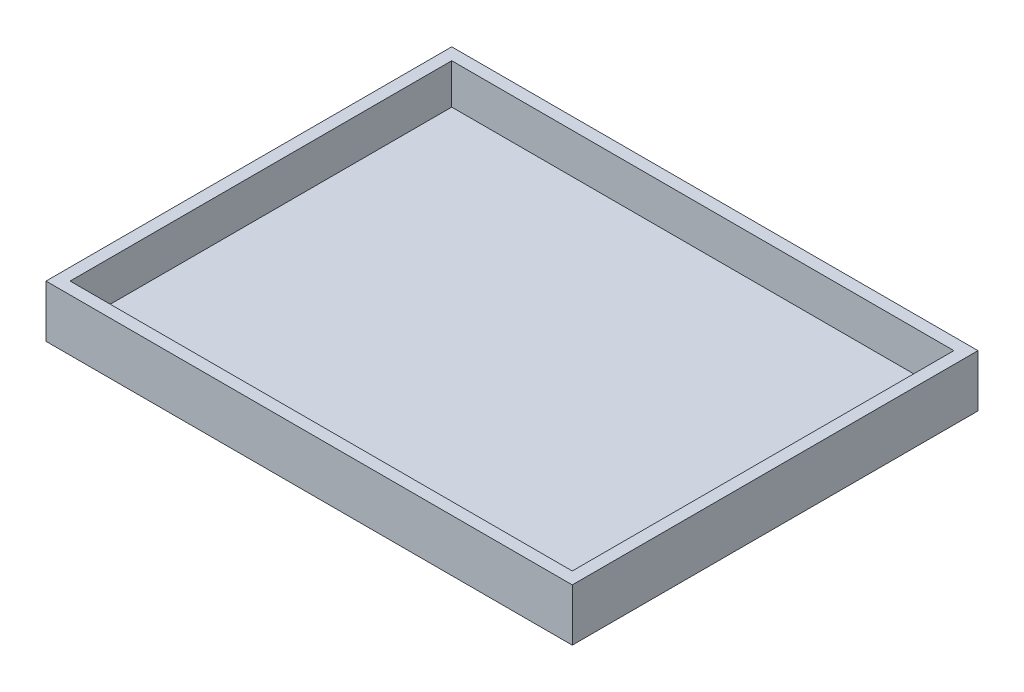
ISO-10303-21;
HEADER;
FILE_DESCRIPTION(('STEP AP214'),'2;1');
FILE_NAME('part.step','',(''),(''),'','','');
FILE_SCHEMA(('AUTOMOTIVE_DESIGN { 1 0 10303 214 1 1 1 1 }'));
ENDSEC;
DATA;
#1=APPLICATION_CONTEXT('core data for automotive mechanical design processes');
#2=APPLICATION_PROTOCOL_DEFINITION('international standard','automotive_design',2000,#1);
#3=PRODUCT_CONTEXT('',#1,'mechanical');
#4=PRODUCT('Part','Part','',(#3));
#5=PRODUCT_RELATED_PRODUCT_CATEGORY('part','',(#4));
#6=PRODUCT_DEFINITION_FORMATION('','',#4);
#7=PRODUCT_DEFINITION_CONTEXT('part definition',#1,'design');
#8=PRODUCT_DEFINITION('design','',#6,#7);
#9=PRODUCT_DEFINITION_SHAPE('','',#8);
#10=(LENGTH_UNIT() NAMED_UNIT(*) SI_UNIT(.MILLI.,.METRE.));
#11=(NAMED_UNIT(*) PLANE_ANGLE_UNIT() SI_UNIT($,.RADIAN.));
#12=(NAMED_UNIT(*) SI_UNIT($,.STERADIAN.) SOLID_ANGLE_UNIT());
#13=UNCERTAINTY_MEASURE_WITH_UNIT(LENGTH_MEASURE(1.E-05),#10,'distance_accuracy_value','');
#14=(GEOMETRIC_REPRESENTATION_CONTEXT(3) GLOBAL_UNCERTAINTY_ASSIGNED_CONTEXT((#13)) GLOBAL_UNIT_ASSIGNED_CONTEXT((#10,
#11,#12)) REPRESENTATION_CONTEXT('',''));
#15=CARTESIAN_POINT('',(0.,0.,0.));
#16=DIRECTION('',(0.,0.,1.));
#17=DIRECTION('',(1.,0.,0.));
#18=AXIS2_PLACEMENT_3D('',#15,#16,#17);
#19=CARTESIAN_POINT('',(-1.2,4.,0.));
#20=DIRECTION('',(1.,0.,0.));
#21=DIRECTION('',(0.,0.,-1.));
#22=AXIS2_PLACEMENT_3D('',#19,#20,#21);
#23=PLANE('',#22);
#24=DIRECTION('',(0.,0.,1.));
#25=VECTOR('',#24,1.);
#26=CARTESIAN_POINT('',(-1.2,-1.2,0.));
#27=LINE('',#26,#25);
#28=CARTESIAN_POINT('',(-1.2,-1.2,-1.2));
#29=VERTEX_POINT('',#28);
#30=CARTESIAN_POINT('',(-1.2,-1.2,39.2));
#31=VERTEX_POINT('',#30);
#32=EDGE_CURVE('E125',#29,#31,#27,.T.);
#33=ORIENTED_EDGE('',*,*,#32,.T.);
#34=DIRECTION('',(0.,-1.,0.));
#35=VECTOR('',#34,1.);
#36=CARTESIAN_POINT('',(-1.2,4.,39.2));
#37=LINE('',#36,#35);
#38=CARTESIAN_POINT('',(-1.2,4.,39.2));
#39=VERTEX_POINT('',#38);
#40=EDGE_CURVE('E11',#39,#31,#37,.T.);
#41=ORIENTED_EDGE('',*,*,#40,.F.);
#42=DIRECTION('',(0.,0.,1.));
#43=VECTOR('',#42,1.);
#44=CARTESIAN_POINT('',(-1.2,4.,0.));
#45=LINE('',#44,#43);
#46=CARTESIAN_POINT('',(-1.2,4.,-1.2));
#47=VERTEX_POINT('',#46);
#48=EDGE_CURVE('E161',#47,#39,#45,.T.);
#49=ORIENTED_EDGE('',*,*,#48,.F.);
#50=DIRECTION('',(0.,-1.,0.));
#51=VECTOR('',#50,1.);
#52=CARTESIAN_POINT('',(-1.2,4.,-1.2));
#53=LINE('',#52,#51);
#54=EDGE_CURVE('E148',#47,#29,#53,.T.);
#55=ORIENTED_EDGE('',*,*,#54,.T.);
#56=EDGE_LOOP('',(#33,#41,#49,#55));
#57=FACE_BOUND('',#56,.T.);
#58=ADVANCED_FACE('F37',(#57),#23,.F.);
#59=CARTESIAN_POINT('',(0.,4.,39.2));
#60=DIRECTION('',(0.,0.,-1.));
#61=DIRECTION('',(-1.,0.,0.));
#62=AXIS2_PLACEMENT_3D('',#59,#60,#61);
#63=PLANE('',#62);
#64=DIRECTION('',(1.,0.,0.));
#65=VECTOR('',#64,1.);
#66=CARTESIAN_POINT('',(0.,-1.2,39.2));
#67=LINE('',#66,#65);
#68=CARTESIAN_POINT('',(51.2,-1.2,39.2));
#69=VERTEX_POINT('',#68);
#70=EDGE_CURVE('E146',#31,#69,#67,.T.);
#71=ORIENTED_EDGE('',*,*,#70,.T.);
#72=DIRECTION('',(0.,-1.,0.));
#73=VECTOR('',#72,1.);
#74=CARTESIAN_POINT('',(51.2,4.,39.2));
#75=LINE('',#74,#73);
#76=CARTESIAN_POINT('',(51.2,4.,39.2));
#77=VERTEX_POINT('',#76);
#78=EDGE_CURVE('E46',#77,#69,#75,.T.);
#79=ORIENTED_EDGE('',*,*,#78,.F.);
#80=DIRECTION('',(1.,0.,0.));
#81=VECTOR('',#80,1.);
#82=CARTESIAN_POINT('',(0.,4.,39.2));
#83=LINE('',#82,#81);
#84=EDGE_CURVE('E163',#39,#77,#83,.T.);
#85=ORIENTED_EDGE('',*,*,#84,.F.);
#86=ORIENTED_EDGE('',*,*,#40,.T.);
#87=EDGE_LOOP('',(#71,#79,#85,#86));
#88=FACE_BOUND('',#87,.T.);
#89=ADVANCED_FACE('F179',(#88),#63,.F.);
#90=CARTESIAN_POINT('',(51.2,4.,0.));
#91=DIRECTION('',(-1.,0.,0.));
#92=DIRECTION('',(0.,0.,1.));
#93=AXIS2_PLACEMENT_3D('',#90,#91,#92);
#94=PLANE('',#93);
#95=DIRECTION('',(0.,0.,-1.));
#96=VECTOR('',#95,1.);
#97=CARTESIAN_POINT('',(51.2,-1.2,0.));
#98=LINE('',#97,#96);
#99=CARTESIAN_POINT('',(51.2,-1.2,-1.2));
#100=VERTEX_POINT('',#99);
#101=EDGE_CURVE('E153',#69,#100,#98,.T.);
#102=ORIENTED_EDGE('',*,*,#101,.T.);
#103=DIRECTION('',(0.,-1.,0.));
#104=VECTOR('',#103,1.);
#105=CARTESIAN_POINT('',(51.2,4.,-1.2));
#106=LINE('',#105,#104);
#107=CARTESIAN_POINT('',(51.2,4.,-1.2));
#108=VERTEX_POINT('',#107);
#109=EDGE_CURVE('E151',#108,#100,#106,.T.);
#110=ORIENTED_EDGE('',*,*,#109,.F.);
#111=DIRECTION('',(0.,0.,-1.));
#112=VECTOR('',#111,1.);
#113=CARTESIAN_POINT('',(51.2,4.,0.));
#114=LINE('',#113,#112);
#115=EDGE_CURVE('E164',#77,#108,#114,.T.);
#116=ORIENTED_EDGE('',*,*,#115,.F.);
#117=ORIENTED_EDGE('',*,*,#78,.T.);
#118=EDGE_LOOP('',(#102,#110,#116,#117));
#119=FACE_BOUND('',#118,.T.);
#120=ADVANCED_FACE('F169',(#119),#94,.F.);
#121=CARTESIAN_POINT('',(0.,4.,-1.2));
#122=DIRECTION('',(0.,0.,1.));
#123=DIRECTION('',(1.,0.,0.));
#124=AXIS2_PLACEMENT_3D('',#121,#122,#123);
#125=PLANE('',#124);
#126=DIRECTION('',(-1.,0.,0.));
#127=VECTOR('',#126,1.);
#128=CARTESIAN_POINT('',(0.,-1.2,-1.2));
#129=LINE('',#128,#127);
#130=EDGE_CURVE('E157',#100,#29,#129,.T.);
#131=ORIENTED_EDGE('',*,*,#130,.T.);
#132=ORIENTED_EDGE('',*,*,#54,.F.);
#133=DIRECTION('',(-1.,0.,0.));
#134=VECTOR('',#133,1.);
#135=CARTESIAN_POINT('',(0.,4.,-1.2));
#136=LINE('',#135,#134);
#137=EDGE_CURVE('E41',#108,#47,#136,.T.);
#138=ORIENTED_EDGE('',*,*,#137,.F.);
#139=ORIENTED_EDGE('',*,*,#109,.T.);
#140=EDGE_LOOP('',(#131,#132,#138,#139));
#141=FACE_BOUND('',#140,.T.);
#142=ADVANCED_FACE('F173',(#141),#125,.F.);
#143=CARTESIAN_POINT('',(0.,4.,0.));
#144=DIRECTION('',(0.,1.,0.));
#145=DIRECTION('',(0.,0.,1.));
#146=AXIS2_PLACEMENT_3D('',#143,#144,#145);
#147=PLANE('',#146);
#148=DIRECTION('',(0.,0.,1.));
#149=VECTOR('',#148,1.);
#150=CARTESIAN_POINT('',(0.,4.,0.));
#151=LINE('',#150,#149);
#152=CARTESIAN_POINT('',(0.,4.,0.));
#153=VERTEX_POINT('',#152);
#154=CARTESIAN_POINT('',(0.,4.,38.));
#155=VERTEX_POINT('',#154);
#156=EDGE_CURVE('E106',#153,#155,#151,.T.);
#157=ORIENTED_EDGE('',*,*,#156,.F.);
#158=DIRECTION('',(-1.,0.,0.));
#159=VECTOR('',#158,1.);
#160=CARTESIAN_POINT('',(0.,4.,0.));
#161=LINE('',#160,#159);
#162=CARTESIAN_POINT('',(50.,4.,0.));
#163=VERTEX_POINT('',#162);
#164=EDGE_CURVE('E132',#163,#153,#161,.T.);
#165=ORIENTED_EDGE('',*,*,#164,.F.);
#166=DIRECTION('',(0.,0.,-1.));
#167=VECTOR('',#166,1.);
#168=CARTESIAN_POINT('',(50.,4.,0.));
#169=LINE('',#168,#167);
#170=CARTESIAN_POINT('',(50.,4.,38.));
#171=VERTEX_POINT('',#170);
#172=EDGE_CURVE('E130',#171,#163,#169,.T.);
#173=ORIENTED_EDGE('',*,*,#172,.F.);
#174=DIRECTION('',(1.,0.,0.));
#175=VECTOR('',#174,1.);
#176=CARTESIAN_POINT('',(0.,4.,38.));
#177=LINE('',#176,#175);
#178=EDGE_CURVE('E117',#155,#171,#177,.T.);
#179=ORIENTED_EDGE('',*,*,#178,.F.);
#180=EDGE_LOOP('',(#157,#165,#173,#179));
#181=FACE_BOUND('',#180,.T.);
#182=ORIENTED_EDGE('',*,*,#48,.T.);
#183=ORIENTED_EDGE('',*,*,#84,.T.);
#184=ORIENTED_EDGE('',*,*,#115,.T.);
#185=ORIENTED_EDGE('',*,*,#137,.T.);
#186=EDGE_LOOP('',(#182,#183,#184,#185));
#187=FACE_BOUND('',#186,.T.);
#188=ADVANCED_FACE('F129',(#181,#187),#147,.T.);
#189=CARTESIAN_POINT('',(0.,-1.2,0.));
#190=DIRECTION('',(0.,1.,0.));
#191=DIRECTION('',(0.,0.,1.));
#192=AXIS2_PLACEMENT_3D('',#189,#190,#191);
#193=PLANE('',#192);
#194=ORIENTED_EDGE('',*,*,#32,.F.);
#195=ORIENTED_EDGE('',*,*,#130,.F.);
#196=ORIENTED_EDGE('',*,*,#101,.F.);
#197=ORIENTED_EDGE('',*,*,#70,.F.);
#198=EDGE_LOOP('',(#194,#195,#196,#197));
#199=FACE_BOUND('',#198,.T.);
#200=ADVANCED_FACE('F39',(#199),#193,.F.);
#201=CARTESIAN_POINT('',(0.,4.,0.));
#202=DIRECTION('',(1.,0.,0.));
#203=DIRECTION('',(0.,0.,-1.));
#204=AXIS2_PLACEMENT_3D('',#201,#202,#203);
#205=PLANE('',#204);
#206=DIRECTION('',(0.,0.,1.));
#207=VECTOR('',#206,1.);
#208=CARTESIAN_POINT('',(0.,0.,0.));
#209=LINE('',#208,#207);
#210=CARTESIAN_POINT('',(0.,0.,0.));
#211=VERTEX_POINT('',#210);
#212=CARTESIAN_POINT('',(0.,0.,38.));
#213=VERTEX_POINT('',#212);
#214=EDGE_CURVE('E136',#211,#213,#209,.T.);
#215=ORIENTED_EDGE('',*,*,#214,.F.);
#216=DIRECTION('',(0.,-1.,0.));
#217=VECTOR('',#216,1.);
#218=CARTESIAN_POINT('',(0.,4.,0.));
#219=LINE('',#218,#217);
#220=EDGE_CURVE('E113',#153,#211,#219,.T.);
#221=ORIENTED_EDGE('',*,*,#220,.F.);
#222=ORIENTED_EDGE('',*,*,#156,.T.);
#223=DIRECTION('',(0.,-1.,0.));
#224=VECTOR('',#223,1.);
#225=CARTESIAN_POINT('',(0.,4.,38.));
#226=LINE('',#225,#224);
#227=EDGE_CURVE('E110',#155,#213,#226,.T.);
#228=ORIENTED_EDGE('',*,*,#227,.T.);
#229=EDGE_LOOP('',(#215,#221,#222,#228));
#230=FACE_BOUND('',#229,.T.);
#231=ADVANCED_FACE('F109',(#230),#205,.T.);
#232=CARTESIAN_POINT('',(0.,4.,38.));
#233=DIRECTION('',(0.,0.,-1.));
#234=DIRECTION('',(-1.,0.,0.));
#235=AXIS2_PLACEMENT_3D('',#232,#233,#234);
#236=PLANE('',#235);
#237=DIRECTION('',(1.,0.,0.));
#238=VECTOR('',#237,1.);
#239=CARTESIAN_POINT('',(0.,0.,38.));
#240=LINE('',#239,#238);
#241=CARTESIAN_POINT('',(50.,0.,38.));
#242=VERTEX_POINT('',#241);
#243=EDGE_CURVE('E124',#213,#242,#240,.T.);
#244=ORIENTED_EDGE('',*,*,#243,.F.);
#245=ORIENTED_EDGE('',*,*,#227,.F.);
#246=ORIENTED_EDGE('',*,*,#178,.T.);
#247=DIRECTION('',(0.,-1.,0.));
#248=VECTOR('',#247,1.);
#249=CARTESIAN_POINT('',(50.,4.,38.));
#250=LINE('',#249,#248);
#251=EDGE_CURVE('E126',#171,#242,#250,.T.);
#252=ORIENTED_EDGE('',*,*,#251,.T.);
#253=EDGE_LOOP('',(#244,#245,#246,#252));
#254=FACE_BOUND('',#253,.T.);
#255=ADVANCED_FACE('F121',(#254),#236,.T.);
#256=CARTESIAN_POINT('',(50.,4.,0.));
#257=DIRECTION('',(-1.,0.,0.));
#258=DIRECTION('',(0.,0.,1.));
#259=AXIS2_PLACEMENT_3D('',#256,#257,#258);
#260=PLANE('',#259);
#261=DIRECTION('',(0.,0.,-1.));
#262=VECTOR('',#261,1.);
#263=CARTESIAN_POINT('',(50.,0.,0.));
#264=LINE('',#263,#262);
#265=CARTESIAN_POINT('',(50.,0.,0.));
#266=VERTEX_POINT('',#265);
#267=EDGE_CURVE('E139',#242,#266,#264,.T.);
#268=ORIENTED_EDGE('',*,*,#267,.F.);
#269=ORIENTED_EDGE('',*,*,#251,.F.);
#270=ORIENTED_EDGE('',*,*,#172,.T.);
#271=DIRECTION('',(0.,-1.,0.));
#272=VECTOR('',#271,1.);
#273=CARTESIAN_POINT('',(50.,4.,0.));
#274=LINE('',#273,#272);
#275=EDGE_CURVE('E54',#163,#266,#274,.T.);
#276=ORIENTED_EDGE('',*,*,#275,.T.);
#277=EDGE_LOOP('',(#268,#269,#270,#276));
#278=FACE_BOUND('',#277,.T.);
#279=ADVANCED_FACE('F224',(#278),#260,.T.);
#280=CARTESIAN_POINT('',(0.,4.,0.));
#281=DIRECTION('',(0.,0.,1.));
#282=DIRECTION('',(1.,0.,0.));
#283=AXIS2_PLACEMENT_3D('',#280,#281,#282);
#284=PLANE('',#283);
#285=DIRECTION('',(-1.,0.,0.));
#286=VECTOR('',#285,1.);
#287=CARTESIAN_POINT('',(0.,0.,0.));
#288=LINE('',#287,#286);
#289=EDGE_CURVE('E118',#266,#211,#288,.T.);
#290=ORIENTED_EDGE('',*,*,#289,.F.);
#291=ORIENTED_EDGE('',*,*,#275,.F.);
#292=ORIENTED_EDGE('',*,*,#164,.T.);
#293=ORIENTED_EDGE('',*,*,#220,.T.);
#294=EDGE_LOOP('',(#290,#291,#292,#293));
#295=FACE_BOUND('',#294,.T.);
#296=ADVANCED_FACE('F233',(#295),#284,.T.);
#297=CARTESIAN_POINT('',(0.,0.,0.));
#298=DIRECTION('',(0.,1.,0.));
#299=DIRECTION('',(0.,0.,1.));
#300=AXIS2_PLACEMENT_3D('',#297,#298,#299);
#301=PLANE('',#300);
#302=ORIENTED_EDGE('',*,*,#214,.T.);
#303=ORIENTED_EDGE('',*,*,#243,.T.);
#304=ORIENTED_EDGE('',*,*,#267,.T.);
#305=ORIENTED_EDGE('',*,*,#289,.T.);
#306=EDGE_LOOP('',(#302,#303,#304,#305));
#307=FACE_BOUND('',#306,.T.);
#308=ADVANCED_FACE('F243',(#307),#301,.T.);
#309=CLOSED_SHELL('',(#58,#89,#120,#142,#188,#200,#231,#255,#279,#296,#308));
#310=MANIFOLD_SOLID_BREP('B2',#309);
#311=ADVANCED_BREP_SHAPE_REPRESENTATION('',(#18,#310),#14);
#312=SHAPE_DEFINITION_REPRESENTATION(#9,#311);
ENDSEC;
END-ISO-10303-21;
